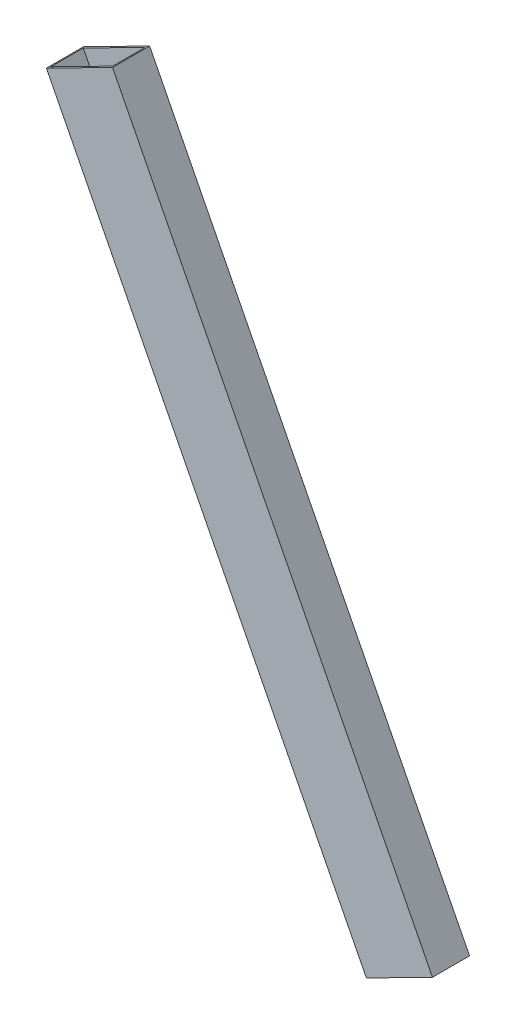
ISO-10303-21;
HEADER;
FILE_DESCRIPTION(('STEP AP214'),'2;1');
FILE_NAME('part.step','',(''),(''),'','','');
FILE_SCHEMA(('AUTOMOTIVE_DESIGN { 1 0 10303 214 1 1 1 1 }'));
ENDSEC;
DATA;
#1=APPLICATION_CONTEXT('core data for automotive mechanical design processes');
#2=APPLICATION_PROTOCOL_DEFINITION('international standard','automotive_design',2000,#1);
#3=PRODUCT_CONTEXT('',#1,'mechanical');
#4=PRODUCT('Part','Part','',(#3));
#5=PRODUCT_RELATED_PRODUCT_CATEGORY('part','',(#4));
#6=PRODUCT_DEFINITION_FORMATION('','',#4);
#7=PRODUCT_DEFINITION_CONTEXT('part definition',#1,'design');
#8=PRODUCT_DEFINITION('design','',#6,#7);
#9=PRODUCT_DEFINITION_SHAPE('','',#8);
#10=(LENGTH_UNIT() NAMED_UNIT(*) SI_UNIT(.MILLI.,.METRE.));
#11=(NAMED_UNIT(*) PLANE_ANGLE_UNIT() SI_UNIT($,.RADIAN.));
#12=(NAMED_UNIT(*) SI_UNIT($,.STERADIAN.) SOLID_ANGLE_UNIT());
#13=UNCERTAINTY_MEASURE_WITH_UNIT(LENGTH_MEASURE(1.E-05),#10,'distance_accuracy_value','');
#14=(GEOMETRIC_REPRESENTATION_CONTEXT(3) GLOBAL_UNCERTAINTY_ASSIGNED_CONTEXT((#13)) GLOBAL_UNIT_ASSIGNED_CONTEXT((#10,
#11,#12)) REPRESENTATION_CONTEXT('',''));
#15=CARTESIAN_POINT('',(0.,0.,0.));
#16=DIRECTION('',(0.,0.,1.));
#17=DIRECTION('',(1.,0.,0.));
#18=AXIS2_PLACEMENT_3D('',#15,#16,#17);
#19=CARTESIAN_POINT('',(287.192645937177,547.499485715767,234.95));
#20=DIRECTION('',(0.453990499739553,-0.891006524188365,0.));
#21=DIRECTION('',(0.891006524188365,0.453990499739553,0.));
#22=AXIS2_PLACEMENT_3D('',#19,#20,#21);
#23=PLANE('',#22);
#24=DIRECTION('',(0.891006524188365,0.453990499739553,0.));
#25=VECTOR('',#24,1.);
#26=CARTESIAN_POINT('',(287.192645937177,547.499485715767,260.35));
#27=LINE('',#26,#25);
#28=CARTESIAN_POINT('',(287.192645937177,547.499485715767,260.35));
#29=VERTEX_POINT('',#28);
#30=CARTESIAN_POINT('',(332.455777365946,570.562203102537,260.35));
#31=VERTEX_POINT('',#30);
#32=EDGE_CURVE('E135',#29,#31,#27,.T.);
#33=ORIENTED_EDGE('',*,*,#32,.F.);
#34=DIRECTION('',(0.,0.,1.));
#35=VECTOR('',#34,1.);
#36=CARTESIAN_POINT('',(287.192645937177,547.499485715767,234.95));
#37=LINE('',#36,#35);
#38=CARTESIAN_POINT('',(287.192645937177,547.499485715767,234.95));
#39=VERTEX_POINT('',#38);
#40=EDGE_CURVE('E11',#39,#29,#37,.T.);
#41=ORIENTED_EDGE('',*,*,#40,.F.);
#42=DIRECTION('',(0.891006524188365,0.453990499739553,0.));
#43=VECTOR('',#42,1.);
#44=CARTESIAN_POINT('',(287.192645937177,547.499485715767,234.95));
#45=LINE('',#44,#43);
#46=CARTESIAN_POINT('',(332.455777365946,570.562203102537,234.95));
#47=VERTEX_POINT('',#46);
#48=EDGE_CURVE('E139',#39,#47,#45,.T.);
#49=ORIENTED_EDGE('',*,*,#48,.T.);
#50=DIRECTION('',(0.,0.,1.));
#51=VECTOR('',#50,1.);
#52=CARTESIAN_POINT('',(332.455777365946,570.562203102537,234.95));
#53=LINE('',#52,#51);
#54=EDGE_CURVE('E42',#47,#31,#53,.T.);
#55=ORIENTED_EDGE('',*,*,#54,.T.);
#56=EDGE_LOOP('',(#33,#41,#49,#55));
#57=FACE_BOUND('',#56,.T.);
#58=DIRECTION('',(0.,0.,1.));
#59=VECTOR('',#58,1.);
#60=CARTESIAN_POINT('',(288.607118794326,548.220195634104,234.95));
#61=LINE('',#60,#59);
#62=CARTESIAN_POINT('',(288.607118794326,548.220195634104,236.5375));
#63=VERTEX_POINT('',#62);
#64=CARTESIAN_POINT('',(288.607118794326,548.220195634104,258.7625));
#65=VERTEX_POINT('',#64);
#66=EDGE_CURVE('E121',#63,#65,#61,.T.);
#67=ORIENTED_EDGE('',*,*,#66,.T.);
#68=DIRECTION('',(0.891006524188365,0.453990499739553,0.));
#69=VECTOR('',#68,1.);
#70=CARTESIAN_POINT('',(-162.275672133575,318.483938917259,258.7625));
#71=LINE('',#70,#69);
#72=CARTESIAN_POINT('',(331.041304508797,569.8414931842,258.7625));
#73=VERTEX_POINT('',#72);
#74=EDGE_CURVE('E112',#65,#73,#71,.T.);
#75=ORIENTED_EDGE('',*,*,#74,.T.);
#76=DIRECTION('',(0.,0.,1.));
#77=VECTOR('',#76,1.);
#78=CARTESIAN_POINT('',(331.041304508797,569.8414931842,234.95));
#79=LINE('',#78,#77);
#80=CARTESIAN_POINT('',(331.041304508797,569.8414931842,236.5375));
#81=VERTEX_POINT('',#80);
#82=EDGE_CURVE('E131',#81,#73,#79,.T.);
#83=ORIENTED_EDGE('',*,*,#82,.F.);
#84=DIRECTION('',(0.891006524188365,0.453990499739553,0.));
#85=VECTOR('',#84,1.);
#86=CARTESIAN_POINT('',(-162.275672133575,318.483938917259,236.5375));
#87=LINE('',#86,#85);
#88=EDGE_CURVE('E55',#63,#81,#87,.T.);
#89=ORIENTED_EDGE('',*,*,#88,.F.);
#90=EDGE_LOOP('',(#67,#75,#83,#89));
#91=FACE_BOUND('',#90,.T.);
#92=ADVANCED_FACE('F39',(#57,#91),#23,.T.);
#93=CARTESIAN_POINT('',(68.0968307628693,977.499234289073,234.95));
#94=DIRECTION('',(0.453990499739553,-0.891006524188365,0.));
#95=DIRECTION('',(0.891006524188365,0.453990499739553,0.));
#96=AXIS2_PLACEMENT_3D('',#93,#94,#95);
#97=PLANE('',#96);
#98=DIRECTION('',(0.891006524188365,0.453990499739553,0.));
#99=VECTOR('',#98,1.);
#100=CARTESIAN_POINT('',(68.0968307628693,977.499234289073,260.35));
#101=LINE('',#100,#99);
#102=CARTESIAN_POINT('',(68.0968307628693,977.499234289073,260.35));
#103=VERTEX_POINT('',#102);
#104=CARTESIAN_POINT('',(113.359962191638,1000.56195167584,260.35));
#105=VERTEX_POINT('',#104);
#106=EDGE_CURVE('E155',#103,#105,#101,.T.);
#107=ORIENTED_EDGE('',*,*,#106,.T.);
#108=DIRECTION('',(0.,0.,1.));
#109=VECTOR('',#108,1.);
#110=CARTESIAN_POINT('',(113.359962191638,1000.56195167584,234.95));
#111=LINE('',#110,#109);
#112=CARTESIAN_POINT('',(113.359962191638,1000.56195167584,234.95));
#113=VERTEX_POINT('',#112);
#114=EDGE_CURVE('E160',#113,#105,#111,.T.);
#115=ORIENTED_EDGE('',*,*,#114,.F.);
#116=DIRECTION('',(0.891006524188365,0.453990499739553,0.));
#117=VECTOR('',#116,1.);
#118=CARTESIAN_POINT('',(68.0968307628693,977.499234289073,234.95));
#119=LINE('',#118,#117);
#120=CARTESIAN_POINT('',(68.0968307628693,977.499234289073,234.95));
#121=VERTEX_POINT('',#120);
#122=EDGE_CURVE('E146',#121,#113,#119,.T.);
#123=ORIENTED_EDGE('',*,*,#122,.F.);
#124=DIRECTION('',(0.,0.,1.));
#125=VECTOR('',#124,1.);
#126=CARTESIAN_POINT('',(68.0968307628693,977.499234289073,234.95));
#127=LINE('',#126,#125);
#128=EDGE_CURVE('E47',#121,#103,#127,.T.);
#129=ORIENTED_EDGE('',*,*,#128,.T.);
#130=EDGE_LOOP('',(#107,#115,#123,#129));
#131=FACE_BOUND('',#130,.T.);
#132=DIRECTION('',(0.891006524188365,0.453990499739553,0.));
#133=VECTOR('',#132,1.);
#134=CARTESIAN_POINT('',(-381.371487307883,748.483687490563,258.7625));
#135=LINE('',#134,#133);
#136=CARTESIAN_POINT('',(69.5113036200183,978.219944207409,258.7625));
#137=VERTEX_POINT('',#136);
#138=CARTESIAN_POINT('',(111.945489334489,999.841241757505,258.7625));
#139=VERTEX_POINT('',#138);
#140=EDGE_CURVE('E109',#137,#139,#135,.T.);
#141=ORIENTED_EDGE('',*,*,#140,.F.);
#142=DIRECTION('',(0.,0.,1.));
#143=VECTOR('',#142,1.);
#144=CARTESIAN_POINT('',(69.5113036200183,978.219944207409,234.95));
#145=LINE('',#144,#143);
#146=CARTESIAN_POINT('',(69.5113036200183,978.219944207409,236.5375));
#147=VERTEX_POINT('',#146);
#148=EDGE_CURVE('E117',#147,#137,#145,.T.);
#149=ORIENTED_EDGE('',*,*,#148,.F.);
#150=DIRECTION('',(0.891006524188365,0.453990499739553,0.));
#151=VECTOR('',#150,1.);
#152=CARTESIAN_POINT('',(-381.371487307883,748.483687490563,236.5375));
#153=LINE('',#152,#151);
#154=CARTESIAN_POINT('',(111.945489334489,999.841241757505,236.5375));
#155=VERTEX_POINT('',#154);
#156=EDGE_CURVE('E60',#147,#155,#153,.T.);
#157=ORIENTED_EDGE('',*,*,#156,.T.);
#158=DIRECTION('',(0.,0.,1.));
#159=VECTOR('',#158,1.);
#160=CARTESIAN_POINT('',(111.945489334489,999.841241757505,234.95));
#161=LINE('',#160,#159);
#162=EDGE_CURVE('E122',#155,#139,#161,.T.);
#163=ORIENTED_EDGE('',*,*,#162,.T.);
#164=EDGE_LOOP('',(#141,#149,#157,#163));
#165=FACE_BOUND('',#164,.T.);
#166=ADVANCED_FACE('F125',(#131,#165),#97,.F.);
#167=CARTESIAN_POINT('',(287.192645937177,547.499485715767,234.95));
#168=DIRECTION('',(0.891006524188366,0.453990499739551,0.));
#169=DIRECTION('',(-0.453990499739551,0.891006524188366,0.));
#170=AXIS2_PLACEMENT_3D('',#167,#168,#169);
#171=PLANE('',#170);
#172=DIRECTION('',(-0.453990499739551,0.891006524188366,0.));
#173=VECTOR('',#172,1.);
#174=CARTESIAN_POINT('',(287.192645937177,547.499485715767,260.35));
#175=LINE('',#174,#173);
#176=EDGE_CURVE('E143',#29,#103,#175,.T.);
#177=ORIENTED_EDGE('',*,*,#176,.T.);
#178=ORIENTED_EDGE('',*,*,#128,.F.);
#179=DIRECTION('',(-0.453990499739551,0.891006524188366,0.));
#180=VECTOR('',#179,1.);
#181=CARTESIAN_POINT('',(287.192645937177,547.499485715767,234.95));
#182=LINE('',#181,#180);
#183=EDGE_CURVE('E148',#39,#121,#182,.T.);
#184=ORIENTED_EDGE('',*,*,#183,.F.);
#185=ORIENTED_EDGE('',*,*,#40,.T.);
#186=EDGE_LOOP('',(#177,#178,#184,#185));
#187=FACE_BOUND('',#186,.T.);
#188=ADVANCED_FACE('F176',(#187),#171,.F.);
#189=CARTESIAN_POINT('',(332.455777365946,570.562203102537,234.95));
#190=DIRECTION('',(0.891006524188366,0.453990499739551,0.));
#191=DIRECTION('',(-0.453990499739551,0.891006524188366,0.));
#192=AXIS2_PLACEMENT_3D('',#189,#190,#191);
#193=PLANE('',#192);
#194=DIRECTION('',(-0.453990499739551,0.891006524188366,0.));
#195=VECTOR('',#194,1.);
#196=CARTESIAN_POINT('',(332.455777365946,570.562203102537,260.35));
#197=LINE('',#196,#195);
#198=EDGE_CURVE('E152',#31,#105,#197,.T.);
#199=ORIENTED_EDGE('',*,*,#198,.F.);
#200=ORIENTED_EDGE('',*,*,#54,.F.);
#201=DIRECTION('',(-0.453990499739551,0.891006524188366,0.));
#202=VECTOR('',#201,1.);
#203=CARTESIAN_POINT('',(332.455777365946,570.562203102537,234.95));
#204=LINE('',#203,#202);
#205=EDGE_CURVE('E142',#47,#113,#204,.T.);
#206=ORIENTED_EDGE('',*,*,#205,.T.);
#207=ORIENTED_EDGE('',*,*,#114,.T.);
#208=EDGE_LOOP('',(#199,#200,#206,#207));
#209=FACE_BOUND('',#208,.T.);
#210=ADVANCED_FACE('F169',(#209),#193,.T.);
#211=CARTESIAN_POINT('',(0.,0.,234.95));
#212=DIRECTION('',(0.,0.,1.));
#213=DIRECTION('',(1.,0.,0.));
#214=AXIS2_PLACEMENT_3D('',#211,#212,#213);
#215=PLANE('',#214);
#216=ORIENTED_EDGE('',*,*,#48,.F.);
#217=ORIENTED_EDGE('',*,*,#183,.T.);
#218=ORIENTED_EDGE('',*,*,#122,.T.);
#219=ORIENTED_EDGE('',*,*,#205,.F.);
#220=EDGE_LOOP('',(#216,#217,#218,#219));
#221=FACE_BOUND('',#220,.T.);
#222=ADVANCED_FACE('F181',(#221),#215,.F.);
#223=CARTESIAN_POINT('',(0.,0.,260.35));
#224=DIRECTION('',(0.,0.,1.));
#225=DIRECTION('',(1.,0.,0.));
#226=AXIS2_PLACEMENT_3D('',#223,#224,#225);
#227=PLANE('',#226);
#228=ORIENTED_EDGE('',*,*,#32,.T.);
#229=ORIENTED_EDGE('',*,*,#198,.T.);
#230=ORIENTED_EDGE('',*,*,#106,.F.);
#231=ORIENTED_EDGE('',*,*,#176,.F.);
#232=EDGE_LOOP('',(#228,#229,#230,#231));
#233=FACE_BOUND('',#232,.T.);
#234=ADVANCED_FACE('F173',(#233),#227,.T.);
#235=CARTESIAN_POINT('',(288.607118794326,548.220195634104,234.95));
#236=DIRECTION('',(0.891006524188366,0.453990499739551,0.));
#237=DIRECTION('',(-0.453990499739551,0.891006524188366,0.));
#238=AXIS2_PLACEMENT_3D('',#235,#236,#237);
#239=PLANE('',#238);
#240=DIRECTION('',(-0.453990499739551,0.891006524188366,0.));
#241=VECTOR('',#240,1.);
#242=CARTESIAN_POINT('',(450.882790927901,229.736256716844,258.7625));
#243=LINE('',#242,#241);
#244=EDGE_CURVE('E104',#65,#137,#243,.T.);
#245=ORIENTED_EDGE('',*,*,#244,.F.);
#246=ORIENTED_EDGE('',*,*,#66,.F.);
#247=DIRECTION('',(-0.453990499739551,0.891006524188366,0.));
#248=VECTOR('',#247,1.);
#249=CARTESIAN_POINT('',(450.882790927901,229.736256716844,236.5375));
#250=LINE('',#249,#248);
#251=EDGE_CURVE('E119',#63,#147,#250,.T.);
#252=ORIENTED_EDGE('',*,*,#251,.T.);
#253=ORIENTED_EDGE('',*,*,#148,.T.);
#254=EDGE_LOOP('',(#245,#246,#252,#253));
#255=FACE_BOUND('',#254,.T.);
#256=ADVANCED_FACE('F118',(#255),#239,.T.);
#257=CARTESIAN_POINT('',(331.041304508797,569.8414931842,234.95));
#258=DIRECTION('',(0.891006524188366,0.453990499739551,0.));
#259=DIRECTION('',(-0.453990499739551,0.891006524188366,0.));
#260=AXIS2_PLACEMENT_3D('',#257,#258,#259);
#261=PLANE('',#260);
#262=DIRECTION('',(-0.453990499739551,0.891006524188366,0.));
#263=VECTOR('',#262,1.);
#264=CARTESIAN_POINT('',(493.316976642372,251.35755426694,258.7625));
#265=LINE('',#264,#263);
#266=EDGE_CURVE('E126',#73,#139,#265,.T.);
#267=ORIENTED_EDGE('',*,*,#266,.T.);
#268=ORIENTED_EDGE('',*,*,#162,.F.);
#269=DIRECTION('',(-0.453990499739551,0.891006524188366,0.));
#270=VECTOR('',#269,1.);
#271=CARTESIAN_POINT('',(493.316976642372,251.35755426694,236.5375));
#272=LINE('',#271,#270);
#273=EDGE_CURVE('E133',#81,#155,#272,.T.);
#274=ORIENTED_EDGE('',*,*,#273,.F.);
#275=ORIENTED_EDGE('',*,*,#82,.T.);
#276=EDGE_LOOP('',(#267,#268,#274,#275));
#277=FACE_BOUND('',#276,.T.);
#278=ADVANCED_FACE('F236',(#277),#261,.F.);
#279=CARTESIAN_POINT('',(0.,0.,236.5375));
#280=DIRECTION('',(0.,0.,1.));
#281=DIRECTION('',(1.,0.,0.));
#282=AXIS2_PLACEMENT_3D('',#279,#280,#281);
#283=PLANE('',#282);
#284=ORIENTED_EDGE('',*,*,#88,.T.);
#285=ORIENTED_EDGE('',*,*,#273,.T.);
#286=ORIENTED_EDGE('',*,*,#156,.F.);
#287=ORIENTED_EDGE('',*,*,#251,.F.);
#288=EDGE_LOOP('',(#284,#285,#286,#287));
#289=FACE_BOUND('',#288,.T.);
#290=ADVANCED_FACE('F245',(#289),#283,.T.);
#291=CARTESIAN_POINT('',(0.,0.,258.7625));
#292=DIRECTION('',(0.,0.,1.));
#293=DIRECTION('',(1.,0.,0.));
#294=AXIS2_PLACEMENT_3D('',#291,#292,#293);
#295=PLANE('',#294);
#296=ORIENTED_EDGE('',*,*,#74,.F.);
#297=ORIENTED_EDGE('',*,*,#244,.T.);
#298=ORIENTED_EDGE('',*,*,#140,.T.);
#299=ORIENTED_EDGE('',*,*,#266,.F.);
#300=EDGE_LOOP('',(#296,#297,#298,#299));
#301=FACE_BOUND('',#300,.T.);
#302=ADVANCED_FACE('F106',(#301),#295,.F.);
#303=CLOSED_SHELL('',(#92,#166,#188,#210,#222,#234,#256,#278,#290,#302));
#304=MANIFOLD_SOLID_BREP('B2',#303);
#305=ADVANCED_BREP_SHAPE_REPRESENTATION('',(#18,#304),#14);
#306=SHAPE_DEFINITION_REPRESENTATION(#9,#305);
ENDSEC;
END-ISO-10303-21;
